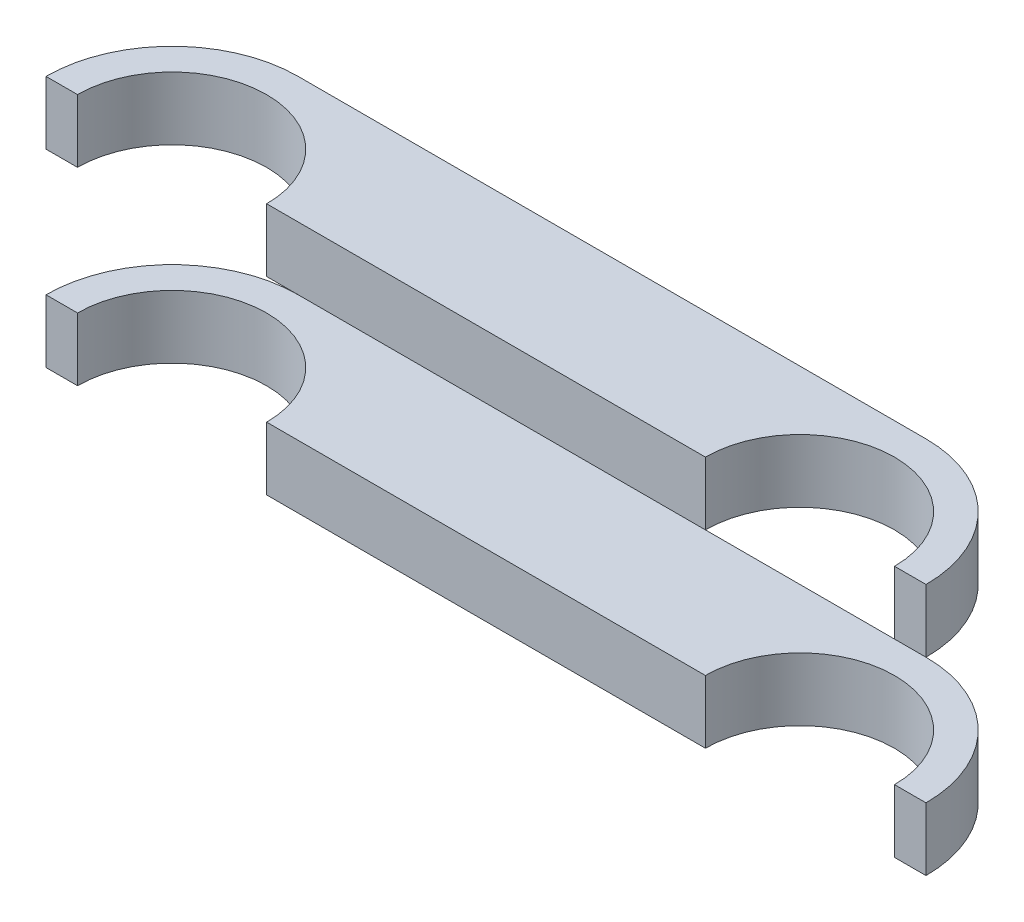
ISO-10303-21;
HEADER;
FILE_DESCRIPTION(('STEP AP214'),'2;1');
FILE_NAME('part.step','',(''),(''),'','','');
FILE_SCHEMA(('AUTOMOTIVE_DESIGN { 1 0 10303 214 1 1 1 1 }'));
ENDSEC;
DATA;
#1=APPLICATION_CONTEXT('core data for automotive mechanical design processes');
#2=APPLICATION_PROTOCOL_DEFINITION('international standard','automotive_design',2000,#1);
#3=PRODUCT_CONTEXT('',#1,'mechanical');
#4=PRODUCT('Part','Part','',(#3));
#5=PRODUCT_RELATED_PRODUCT_CATEGORY('part','',(#4));
#6=PRODUCT_DEFINITION_FORMATION('','',#4);
#7=PRODUCT_DEFINITION_CONTEXT('part definition',#1,'design');
#8=PRODUCT_DEFINITION('design','',#6,#7);
#9=PRODUCT_DEFINITION_SHAPE('','',#8);
#10=(LENGTH_UNIT() NAMED_UNIT(*) SI_UNIT(.MILLI.,.METRE.));
#11=(NAMED_UNIT(*) PLANE_ANGLE_UNIT() SI_UNIT($,.RADIAN.));
#12=(NAMED_UNIT(*) SI_UNIT($,.STERADIAN.) SOLID_ANGLE_UNIT());
#13=UNCERTAINTY_MEASURE_WITH_UNIT(LENGTH_MEASURE(1.E-05),#10,'distance_accuracy_value','');
#14=(GEOMETRIC_REPRESENTATION_CONTEXT(3) GLOBAL_UNCERTAINTY_ASSIGNED_CONTEXT((#13)) GLOBAL_UNIT_ASSIGNED_CONTEXT((#10,
#11,#12)) REPRESENTATION_CONTEXT('',''));
#15=CARTESIAN_POINT('',(0.,0.,0.));
#16=DIRECTION('',(0.,0.,1.));
#17=DIRECTION('',(1.,0.,0.));
#18=AXIS2_PLACEMENT_3D('',#15,#16,#17);
#19=CARTESIAN_POINT('',(0.,-3.175,0.));
#20=DIRECTION('',(0.,1.,0.));
#21=DIRECTION('',(0.,0.,1.));
#22=AXIS2_PLACEMENT_3D('',#19,#20,#21);
#23=PLANE('',#22);
#24=DIRECTION('',(1.,0.,0.));
#25=VECTOR('',#24,1.);
#26=CARTESIAN_POINT('',(0.,-3.175,-10.3187500000315));
#27=LINE('',#26,#25);
#28=CARTESIAN_POINT('',(-11.08075,-3.175,-10.3187500000315));
#29=VERTEX_POINT('',#28);
#30=CARTESIAN_POINT('',(-10.2870000000001,-3.175,-10.3187500000296));
#31=VERTEX_POINT('',#30);
#32=EDGE_CURVE('E54',#29,#31,#27,.T.);
#33=ORIENTED_EDGE('',*,*,#32,.F.);
#34=CARTESIAN_POINT('',(-7.90575,-3.175,-10.31875));
#35=DIRECTION('',(0.,1.,0.));
#36=DIRECTION('',(0.,0.,1.));
#37=AXIS2_PLACEMENT_3D('',#34,#35,#36);
#38=CIRCLE('',#37,3.175);
#39=CARTESIAN_POINT('',(-7.90575,-3.175,-13.49375));
#40=VERTEX_POINT('',#39);
#41=EDGE_CURVE('E122',#40,#29,#38,.T.);
#42=ORIENTED_EDGE('',*,*,#41,.F.);
#43=DIRECTION('',(1.,0.,0.));
#44=VECTOR('',#43,1.);
#45=CARTESIAN_POINT('',(0.,-3.175,-13.49375));
#46=LINE('',#45,#44);
#47=CARTESIAN_POINT('',(7.90575,-3.175,-13.49375));
#48=VERTEX_POINT('',#47);
#49=EDGE_CURVE('E120',#40,#48,#46,.T.);
#50=ORIENTED_EDGE('',*,*,#49,.T.);
#51=CARTESIAN_POINT('',(7.90575,-3.175,-10.31875));
#52=DIRECTION('',(0.,1.,0.));
#53=DIRECTION('',(0.,0.,1.));
#54=AXIS2_PLACEMENT_3D('',#51,#52,#53);
#55=CIRCLE('',#54,3.175);
#56=CARTESIAN_POINT('',(11.08075,-3.175,-10.3187500000315));
#57=VERTEX_POINT('',#56);
#58=EDGE_CURVE('E110',#57,#48,#55,.T.);
#59=ORIENTED_EDGE('',*,*,#58,.F.);
#60=CARTESIAN_POINT('',(10.2869999999999,-3.175,-10.3187500000295));
#61=VERTEX_POINT('',#60);
#62=EDGE_CURVE('E162',#61,#57,#27,.T.);
#63=ORIENTED_EDGE('',*,*,#62,.F.);
#64=CARTESIAN_POINT('',(7.90574999999992,-3.175,-10.3187500000304));
#65=DIRECTION('',(0.,1.,0.));
#66=DIRECTION('',(0.,0.,1.));
#67=AXIS2_PLACEMENT_3D('',#64,#65,#66);
#68=CIRCLE('',#67,2.38125);
#69=CARTESIAN_POINT('',(5.52449999999991,-3.175,-10.3187500000296));
#70=VERTEX_POINT('',#69);
#71=EDGE_CURVE('E150',#70,#61,#68,.F.);
#72=ORIENTED_EDGE('',*,*,#71,.F.);
#73=CARTESIAN_POINT('',(-5.52450000000013,-3.175,-10.3187500000315));
#74=VERTEX_POINT('',#73);
#75=EDGE_CURVE('E144',#74,#70,#27,.T.);
#76=ORIENTED_EDGE('',*,*,#75,.F.);
#77=CARTESIAN_POINT('',(-7.90575000000013,-3.175,-10.3187500000269));
#78=DIRECTION('',(0.,1.,0.));
#79=DIRECTION('',(0.,0.,1.));
#80=AXIS2_PLACEMENT_3D('',#77,#78,#79);
#81=CIRCLE('',#80,2.38125);
#82=EDGE_CURVE('E145',#31,#74,#81,.F.);
#83=ORIENTED_EDGE('',*,*,#82,.F.);
#84=EDGE_LOOP('',(#33,#42,#50,#59,#63,#72,#76,#83));
#85=FACE_BOUND('',#84,.T.);
#86=ADVANCED_FACE('F44',(#85),#23,.F.);
#87=CARTESIAN_POINT('',(7.90575,-3.175,-10.31875));
#88=DIRECTION('',(0.,1.,0.));
#89=DIRECTION('',(0.,0.,1.));
#90=AXIS2_PLACEMENT_3D('',#87,#88,#89);
#91=CYLINDRICAL_SURFACE('',#90,3.175);
#92=CARTESIAN_POINT('',(7.90575,-1.5875,-10.31875));
#93=DIRECTION('',(0.,-1.,0.));
#94=DIRECTION('',(0.,0.,-1.));
#95=AXIS2_PLACEMENT_3D('',#92,#93,#94);
#96=CIRCLE('',#95,3.175);
#97=CARTESIAN_POINT('',(11.08075,-1.5875,-10.3187500000315));
#98=VERTEX_POINT('',#97);
#99=CARTESIAN_POINT('',(7.90575,-1.5875,-13.49375));
#100=VERTEX_POINT('',#99);
#101=EDGE_CURVE('E132',#98,#100,#96,.F.);
#102=ORIENTED_EDGE('',*,*,#101,.F.);
#103=DIRECTION('',(0.,1.,0.));
#104=VECTOR('',#103,1.);
#105=CARTESIAN_POINT('',(11.08075,-3.175,-10.3187500000315));
#106=LINE('',#105,#104);
#107=EDGE_CURVE('E92',#98,#57,#106,.F.);
#108=ORIENTED_EDGE('',*,*,#107,.T.);
#109=ORIENTED_EDGE('',*,*,#58,.T.);
#110=DIRECTION('',(0.,1.,0.));
#111=VECTOR('',#110,1.);
#112=CARTESIAN_POINT('',(7.90575,-3.175,-13.49375));
#113=LINE('',#112,#111);
#114=EDGE_CURVE('E48',#48,#100,#113,.T.);
#115=ORIENTED_EDGE('',*,*,#114,.T.);
#116=EDGE_LOOP('',(#102,#108,#109,#115));
#117=FACE_BOUND('',#116,.T.);
#118=ADVANCED_FACE('F113',(#117),#91,.T.);
#119=CARTESIAN_POINT('',(-7.90575,-3.175,-10.31875));
#120=DIRECTION('',(0.,1.,0.));
#121=DIRECTION('',(0.,0.,1.));
#122=AXIS2_PLACEMENT_3D('',#119,#120,#121);
#123=CYLINDRICAL_SURFACE('',#122,3.175);
#124=ORIENTED_EDGE('',*,*,#41,.T.);
#125=DIRECTION('',(0.,1.,0.));
#126=VECTOR('',#125,1.);
#127=CARTESIAN_POINT('',(-11.08075,-3.175,-10.3187500000315));
#128=LINE('',#127,#126);
#129=CARTESIAN_POINT('',(-11.08075,-1.5875,-10.3187500000315));
#130=VERTEX_POINT('',#129);
#131=EDGE_CURVE('E63',#29,#130,#128,.T.);
#132=ORIENTED_EDGE('',*,*,#131,.T.);
#133=CARTESIAN_POINT('',(-7.90575,-1.5875,-10.31875));
#134=DIRECTION('',(0.,-1.,0.));
#135=DIRECTION('',(0.,0.,-1.));
#136=AXIS2_PLACEMENT_3D('',#133,#134,#135);
#137=CIRCLE('',#136,3.175);
#138=CARTESIAN_POINT('',(-7.90575,-1.5875,-13.49375));
#139=VERTEX_POINT('',#138);
#140=EDGE_CURVE('E138',#139,#130,#137,.F.);
#141=ORIENTED_EDGE('',*,*,#140,.F.);
#142=DIRECTION('',(0.,1.,0.));
#143=VECTOR('',#142,1.);
#144=CARTESIAN_POINT('',(-7.90575,-3.175,-13.49375));
#145=LINE('',#144,#143);
#146=EDGE_CURVE('E165',#40,#139,#145,.T.);
#147=ORIENTED_EDGE('',*,*,#146,.F.);
#148=EDGE_LOOP('',(#124,#132,#141,#147));
#149=FACE_BOUND('',#148,.T.);
#150=ADVANCED_FACE('F167',(#149),#123,.T.);
#151=CARTESIAN_POINT('',(11.6864410687769,-1.5875,4.42758784533106));
#152=DIRECTION('',(0.,-1.,0.));
#153=DIRECTION('',(0.,0.,-1.));
#154=AXIS2_PLACEMENT_3D('',#151,#152,#153);
#155=PLANE('',#154);
#156=DIRECTION('',(-1.,0.,0.));
#157=VECTOR('',#156,1.);
#158=CARTESIAN_POINT('',(11.6864410687769,-1.5875,-10.3187500000315));
#159=LINE('',#158,#157);
#160=CARTESIAN_POINT('',(10.2869999999999,-1.5875,-10.3187500000296));
#161=VERTEX_POINT('',#160);
#162=EDGE_CURVE('E56',#98,#161,#159,.T.);
#163=ORIENTED_EDGE('',*,*,#162,.F.);
#164=ORIENTED_EDGE('',*,*,#101,.T.);
#165=DIRECTION('',(1.,0.,0.));
#166=VECTOR('',#165,1.);
#167=CARTESIAN_POINT('',(0.,-1.5875,-13.49375));
#168=LINE('',#167,#166);
#169=EDGE_CURVE('E129',#139,#100,#168,.T.);
#170=ORIENTED_EDGE('',*,*,#169,.F.);
#171=ORIENTED_EDGE('',*,*,#140,.T.);
#172=CARTESIAN_POINT('',(-10.2870000000001,-1.5875,-10.3187500000298));
#173=VERTEX_POINT('',#172);
#174=EDGE_CURVE('E12',#173,#130,#159,.T.);
#175=ORIENTED_EDGE('',*,*,#174,.F.);
#176=CARTESIAN_POINT('',(-7.90575000000013,-1.5875,-10.3187500000271));
#177=DIRECTION('',(0.,-1.,0.));
#178=DIRECTION('',(0.,0.,-1.));
#179=AXIS2_PLACEMENT_3D('',#176,#177,#178);
#180=CIRCLE('',#179,2.38125);
#181=CARTESIAN_POINT('',(-5.52450000000013,-1.5875,-10.3187500000298));
#182=VERTEX_POINT('',#181);
#183=EDGE_CURVE('E141',#182,#173,#180,.F.);
#184=ORIENTED_EDGE('',*,*,#183,.F.);
#185=DIRECTION('',(-1.,0.,0.));
#186=VECTOR('',#185,1.);
#187=CARTESIAN_POINT('',(2.74963065701559,-1.5875,-10.31875));
#188=LINE('',#187,#186);
#189=CARTESIAN_POINT('',(5.52449999999991,-1.5875,-10.3187500000298));
#190=VERTEX_POINT('',#189);
#191=EDGE_CURVE('E142',#190,#182,#188,.T.);
#192=ORIENTED_EDGE('',*,*,#191,.F.);
#193=CARTESIAN_POINT('',(7.90574999999992,-1.5875,-10.3187500000307));
#194=DIRECTION('',(0.,-1.,0.));
#195=DIRECTION('',(0.,0.,-1.));
#196=AXIS2_PLACEMENT_3D('',#193,#194,#195);
#197=CIRCLE('',#196,2.38125);
#198=EDGE_CURVE('E159',#161,#190,#197,.F.);
#199=ORIENTED_EDGE('',*,*,#198,.F.);
#200=EDGE_LOOP('',(#163,#164,#170,#171,#175,#184,#192,#199));
#201=FACE_BOUND('',#200,.T.);
#202=ADVANCED_FACE('F170',(#201),#155,.F.);
#203=CARTESIAN_POINT('',(-7.90575000000012,8.69949999999987,-10.3187500000289));
#204=DIRECTION('',(0.,-1.,1.6769918786963E-13));
#205=DIRECTION('',(-1.,0.,2.21020759978035E-13));
#206=AXIS2_PLACEMENT_3D('',#203,#204,#205);
#207=CYLINDRICAL_SURFACE('',#206,2.38125);
#208=ORIENTED_EDGE('',*,*,#183,.T.);
#209=DIRECTION('',(0.,-1.,1.6769918786963E-13));
#210=VECTOR('',#209,1.);
#211=CARTESIAN_POINT('',(-10.2870000000001,8.69949999999987,-10.3187500000315));
#212=LINE('',#211,#210);
#213=EDGE_CURVE('E149',#173,#31,#212,.T.);
#214=ORIENTED_EDGE('',*,*,#213,.T.);
#215=ORIENTED_EDGE('',*,*,#82,.T.);
#216=DIRECTION('',(0.,-1.,1.6769918786963E-13));
#217=VECTOR('',#216,1.);
#218=CARTESIAN_POINT('',(-5.52450000000012,8.69949999999987,-10.3187500000315));
#219=LINE('',#218,#217);
#220=EDGE_CURVE('E148',#74,#182,#219,.F.);
#221=ORIENTED_EDGE('',*,*,#220,.T.);
#222=EDGE_LOOP('',(#208,#214,#215,#221));
#223=FACE_BOUND('',#222,.T.);
#224=ADVANCED_FACE('F179',(#223),#207,.F.);
#225=CARTESIAN_POINT('',(7.90574999999992,8.69949999999989,-10.3187500000324));
#226=DIRECTION('',(0.,-1.,1.67588165567167E-13));
#227=DIRECTION('',(1.,0.,-2.20911952267685E-13));
#228=AXIS2_PLACEMENT_3D('',#225,#226,#227);
#229=CYLINDRICAL_SURFACE('',#228,2.38125);
#230=ORIENTED_EDGE('',*,*,#198,.T.);
#231=DIRECTION('',(0.,-1.,1.67588165567167E-13));
#232=VECTOR('',#231,1.);
#233=CARTESIAN_POINT('',(5.52449999999992,8.69949999999989,-10.3187500000315));
#234=LINE('',#233,#232);
#235=EDGE_CURVE('E153',#190,#70,#234,.T.);
#236=ORIENTED_EDGE('',*,*,#235,.T.);
#237=ORIENTED_EDGE('',*,*,#71,.T.);
#238=DIRECTION('',(0.,-1.,1.67588165567167E-13));
#239=VECTOR('',#238,1.);
#240=CARTESIAN_POINT('',(10.2869999999999,8.69949999999989,-10.3187500000315));
#241=LINE('',#240,#239);
#242=EDGE_CURVE('E152',#61,#161,#241,.F.);
#243=ORIENTED_EDGE('',*,*,#242,.T.);
#244=EDGE_LOOP('',(#230,#236,#237,#243));
#245=FACE_BOUND('',#244,.T.);
#246=ADVANCED_FACE('F202',(#245),#229,.F.);
#247=CARTESIAN_POINT('',(0.,-3.175,-13.49375));
#248=DIRECTION('',(0.,0.,1.));
#249=DIRECTION('',(1.,0.,0.));
#250=AXIS2_PLACEMENT_3D('',#247,#248,#249);
#251=PLANE('',#250);
#252=ORIENTED_EDGE('',*,*,#146,.T.);
#253=ORIENTED_EDGE('',*,*,#169,.T.);
#254=ORIENTED_EDGE('',*,*,#114,.F.);
#255=ORIENTED_EDGE('',*,*,#49,.F.);
#256=EDGE_LOOP('',(#252,#253,#254,#255));
#257=FACE_BOUND('',#256,.T.);
#258=ADVANCED_FACE('F127',(#257),#251,.F.);
#259=CARTESIAN_POINT('',(0.,0.,-10.3187500000315));
#260=DIRECTION('',(0.,0.,1.));
#261=DIRECTION('',(1.,0.,0.));
#262=AXIS2_PLACEMENT_3D('',#259,#260,#261);
#263=PLANE('',#262);
#264=ORIENTED_EDGE('',*,*,#62,.T.);
#265=ORIENTED_EDGE('',*,*,#107,.F.);
#266=ORIENTED_EDGE('',*,*,#162,.T.);
#267=ORIENTED_EDGE('',*,*,#242,.F.);
#268=EDGE_LOOP('',(#264,#265,#266,#267));
#269=FACE_BOUND('',#268,.T.);
#270=ADVANCED_FACE('F187',(#269),#263,.T.);
#271=ORIENTED_EDGE('',*,*,#191,.T.);
#272=ORIENTED_EDGE('',*,*,#220,.F.);
#273=ORIENTED_EDGE('',*,*,#75,.T.);
#274=ORIENTED_EDGE('',*,*,#235,.F.);
#275=EDGE_LOOP('',(#271,#272,#273,#274));
#276=FACE_BOUND('',#275,.T.);
#277=ADVANCED_FACE('F184',(#276),#263,.T.);
#278=ORIENTED_EDGE('',*,*,#32,.T.);
#279=ORIENTED_EDGE('',*,*,#213,.F.);
#280=ORIENTED_EDGE('',*,*,#174,.T.);
#281=ORIENTED_EDGE('',*,*,#131,.F.);
#282=EDGE_LOOP('',(#278,#279,#280,#281));
#283=FACE_BOUND('',#282,.T.);
#284=ADVANCED_FACE('F46',(#283),#263,.T.);
#285=CLOSED_SHELL('',(#86,#118,#150,#202,#224,#246,#258,#270,#277,#284));
#286=MANIFOLD_SOLID_BREP('B2',#285);
#287=CARTESIAN_POINT('',(0.,-3.175,-13.49375));
#288=DIRECTION('',(0.,0.,1.));
#289=DIRECTION('',(1.,0.,0.));
#290=AXIS2_PLACEMENT_3D('',#287,#288,#289);
#291=PLANE('',#290);
#292=DIRECTION('',(0.,1.,0.));
#293=VECTOR('',#292,1.);
#294=CARTESIAN_POINT('',(7.90575,-3.175,-13.49375));
#295=LINE('',#294,#293);
#296=CARTESIAN_POINT('',(7.90575,1.5875,-13.49375));
#297=VERTEX_POINT('',#296);
#298=CARTESIAN_POINT('',(7.90575,3.175,-13.49375));
#299=VERTEX_POINT('',#298);
#300=EDGE_CURVE('E385',#297,#299,#295,.T.);
#301=ORIENTED_EDGE('',*,*,#300,.F.);
#302=DIRECTION('',(-1.,0.,0.));
#303=VECTOR('',#302,1.);
#304=CARTESIAN_POINT('',(0.,1.5875,-13.49375));
#305=LINE('',#304,#303);
#306=CARTESIAN_POINT('',(-7.90575,1.5875,-13.49375));
#307=VERTEX_POINT('',#306);
#308=EDGE_CURVE('E348',#297,#307,#305,.T.);
#309=ORIENTED_EDGE('',*,*,#308,.T.);
#310=DIRECTION('',(0.,1.,0.));
#311=VECTOR('',#310,1.);
#312=CARTESIAN_POINT('',(-7.90575,-3.175,-13.49375));
#313=LINE('',#312,#311);
#314=CARTESIAN_POINT('',(-7.90575,3.175,-13.49375));
#315=VERTEX_POINT('',#314);
#316=EDGE_CURVE('E386',#307,#315,#313,.T.);
#317=ORIENTED_EDGE('',*,*,#316,.T.);
#318=DIRECTION('',(1.,0.,0.));
#319=VECTOR('',#318,1.);
#320=CARTESIAN_POINT('',(0.,3.175,-13.49375));
#321=LINE('',#320,#319);
#322=EDGE_CURVE('E379',#315,#299,#321,.T.);
#323=ORIENTED_EDGE('',*,*,#322,.T.);
#324=EDGE_LOOP('',(#301,#309,#317,#323));
#325=FACE_BOUND('',#324,.T.);
#326=ADVANCED_FACE('F275',(#325),#291,.F.);
#327=CARTESIAN_POINT('',(-7.90575000000012,8.69949999999987,-10.3187500000289));
#328=DIRECTION('',(0.,-1.,1.6769918786963E-13));
#329=DIRECTION('',(-1.,0.,2.21020759978035E-13));
#330=AXIS2_PLACEMENT_3D('',#327,#328,#329);
#331=CYLINDRICAL_SURFACE('',#330,2.38125);
#332=CARTESIAN_POINT('',(-7.90575000000012,3.175,-10.3187500000279));
#333=DIRECTION('',(0.,1.,0.));
#334=DIRECTION('',(0.,0.,1.));
#335=AXIS2_PLACEMENT_3D('',#332,#333,#334);
#336=CIRCLE('',#335,2.38125);
#337=CARTESIAN_POINT('',(-10.2870000000001,3.175,-10.3187500000306));
#338=VERTEX_POINT('',#337);
#339=CARTESIAN_POINT('',(-5.52450000000012,3.175,-10.3187500000315));
#340=VERTEX_POINT('',#339);
#341=EDGE_CURVE('E370',#338,#340,#336,.F.);
#342=ORIENTED_EDGE('',*,*,#341,.F.);
#343=DIRECTION('',(0.,-1.,1.6769918786963E-13));
#344=VECTOR('',#343,1.);
#345=CARTESIAN_POINT('',(-10.2870000000001,8.69949999999987,-10.3187500000315));
#346=LINE('',#345,#344);
#347=CARTESIAN_POINT('',(-10.2870000000001,1.5875,-10.3187500000304));
#348=VERTEX_POINT('',#347);
#349=EDGE_CURVE('E412',#338,#348,#346,.T.);
#350=ORIENTED_EDGE('',*,*,#349,.T.);
#351=CARTESIAN_POINT('',(-7.90575000000012,1.5875,-10.3187500000277));
#352=DIRECTION('',(0.,1.,0.));
#353=DIRECTION('',(0.,0.,1.));
#354=AXIS2_PLACEMENT_3D('',#351,#352,#353);
#355=CIRCLE('',#354,2.38125);
#356=CARTESIAN_POINT('',(-5.52450000000012,1.5875,-10.3187500000315));
#357=VERTEX_POINT('',#356);
#358=EDGE_CURVE('E361',#348,#357,#355,.F.);
#359=ORIENTED_EDGE('',*,*,#358,.T.);
#360=DIRECTION('',(0.,-1.,1.6769918786963E-13));
#361=VECTOR('',#360,1.);
#362=CARTESIAN_POINT('',(-5.52450000000012,8.69949999999987,-10.3187500000315));
#363=LINE('',#362,#361);
#364=EDGE_CURVE('E408',#357,#340,#363,.F.);
#365=ORIENTED_EDGE('',*,*,#364,.T.);
#366=EDGE_LOOP('',(#342,#350,#359,#365));
#367=FACE_BOUND('',#366,.T.);
#368=ADVANCED_FACE('F416',(#367),#331,.F.);
#369=CARTESIAN_POINT('',(7.90574999999992,8.69949999999989,-10.3187500000324));
#370=DIRECTION('',(0.,-1.,1.67588165567167E-13));
#371=DIRECTION('',(1.,0.,-2.20911952267685E-13));
#372=AXIS2_PLACEMENT_3D('',#369,#370,#371);
#373=CYLINDRICAL_SURFACE('',#372,2.38125);
#374=CARTESIAN_POINT('',(7.90574999999992,3.175,-10.3187500000315));
#375=DIRECTION('',(0.,1.,0.));
#376=DIRECTION('',(0.,0.,1.));
#377=AXIS2_PLACEMENT_3D('',#374,#375,#376);
#378=CIRCLE('',#377,2.38125);
#379=CARTESIAN_POINT('',(5.52449999999992,3.175,-10.3187500000306));
#380=VERTEX_POINT('',#379);
#381=CARTESIAN_POINT('',(10.2869999999999,3.175,-10.3187500000304));
#382=VERTEX_POINT('',#381);
#383=EDGE_CURVE('E358',#380,#382,#378,.F.);
#384=ORIENTED_EDGE('',*,*,#383,.F.);
#385=DIRECTION('',(0.,-1.,1.67588165567167E-13));
#386=VECTOR('',#385,1.);
#387=CARTESIAN_POINT('',(5.52449999999992,8.69949999999989,-10.3187500000315));
#388=LINE('',#387,#386);
#389=CARTESIAN_POINT('',(5.52449999999991,1.5875,-10.3187500000304));
#390=VERTEX_POINT('',#389);
#391=EDGE_CURVE('E42',#380,#390,#388,.T.);
#392=ORIENTED_EDGE('',*,*,#391,.T.);
#393=CARTESIAN_POINT('',(7.90574999999992,1.5875,-10.3187500000312));
#394=DIRECTION('',(0.,1.,0.));
#395=DIRECTION('',(0.,0.,1.));
#396=AXIS2_PLACEMENT_3D('',#393,#394,#395);
#397=CIRCLE('',#396,2.38125);
#398=CARTESIAN_POINT('',(10.2869999999999,1.5875,-10.3187500000303));
#399=VERTEX_POINT('',#398);
#400=EDGE_CURVE('E353',#390,#399,#397,.F.);
#401=ORIENTED_EDGE('',*,*,#400,.T.);
#402=DIRECTION('',(0.,-1.,1.67588165567167E-13));
#403=VECTOR('',#402,1.);
#404=CARTESIAN_POINT('',(10.2869999999999,8.69949999999989,-10.3187500000315));
#405=LINE('',#404,#403);
#406=EDGE_CURVE('E283',#399,#382,#405,.F.);
#407=ORIENTED_EDGE('',*,*,#406,.T.);
#408=EDGE_LOOP('',(#384,#392,#401,#407));
#409=FACE_BOUND('',#408,.T.);
#410=ADVANCED_FACE('F357',(#409),#373,.F.);
#411=CARTESIAN_POINT('',(11.6864410687769,1.5875,4.42758784533106));
#412=DIRECTION('',(0.,1.,0.));
#413=DIRECTION('',(0.,0.,1.));
#414=AXIS2_PLACEMENT_3D('',#411,#412,#413);
#415=PLANE('',#414);
#416=DIRECTION('',(1.,0.,0.));
#417=VECTOR('',#416,1.);
#418=CARTESIAN_POINT('',(11.6864410687769,1.5875,-10.3187500000315));
#419=LINE('',#418,#417);
#420=CARTESIAN_POINT('',(-11.08075,1.5875,-10.3187500000315));
#421=VERTEX_POINT('',#420);
#422=EDGE_CURVE('E290',#421,#348,#419,.T.);
#423=ORIENTED_EDGE('',*,*,#422,.F.);
#424=CARTESIAN_POINT('',(-7.90575,1.5875,-10.31875));
#425=DIRECTION('',(0.,1.,0.));
#426=DIRECTION('',(0.,0.,1.));
#427=AXIS2_PLACEMENT_3D('',#424,#425,#426);
#428=CIRCLE('',#427,3.175);
#429=EDGE_CURVE('E374',#421,#307,#428,.F.);
#430=ORIENTED_EDGE('',*,*,#429,.T.);
#431=ORIENTED_EDGE('',*,*,#308,.F.);
#432=CARTESIAN_POINT('',(7.90575,1.5875,-10.31875));
#433=DIRECTION('',(0.,1.,0.));
#434=DIRECTION('',(0.,0.,1.));
#435=AXIS2_PLACEMENT_3D('',#432,#433,#434);
#436=CIRCLE('',#435,3.175);
#437=CARTESIAN_POINT('',(11.08075,1.5875,-10.3187500000315));
#438=VERTEX_POINT('',#437);
#439=EDGE_CURVE('E355',#297,#438,#436,.F.);
#440=ORIENTED_EDGE('',*,*,#439,.T.);
#441=EDGE_CURVE('E340',#399,#438,#419,.T.);
#442=ORIENTED_EDGE('',*,*,#441,.F.);
#443=ORIENTED_EDGE('',*,*,#400,.F.);
#444=DIRECTION('',(1.,0.,0.));
#445=VECTOR('',#444,1.);
#446=CARTESIAN_POINT('',(2.74963065701559,1.5875,-10.31875));
#447=LINE('',#446,#445);
#448=EDGE_CURVE('E298',#357,#390,#447,.T.);
#449=ORIENTED_EDGE('',*,*,#448,.F.);
#450=ORIENTED_EDGE('',*,*,#358,.F.);
#451=EDGE_LOOP('',(#423,#430,#431,#440,#442,#443,#449,#450));
#452=FACE_BOUND('',#451,.T.);
#453=ADVANCED_FACE('F352',(#452),#415,.F.);
#454=CARTESIAN_POINT('',(0.,3.175,0.));
#455=DIRECTION('',(0.,1.,0.));
#456=DIRECTION('',(0.,0.,1.));
#457=AXIS2_PLACEMENT_3D('',#454,#455,#456);
#458=PLANE('',#457);
#459=CARTESIAN_POINT('',(-7.90575,3.175,-10.31875));
#460=DIRECTION('',(0.,1.,0.));
#461=DIRECTION('',(0.,0.,1.));
#462=AXIS2_PLACEMENT_3D('',#459,#460,#461);
#463=CIRCLE('',#462,3.175);
#464=CARTESIAN_POINT('',(-11.08075,3.175,-10.3187500000315));
#465=VERTEX_POINT('',#464);
#466=EDGE_CURVE('E382',#315,#465,#463,.T.);
#467=ORIENTED_EDGE('',*,*,#466,.T.);
#468=DIRECTION('',(1.,0.,0.));
#469=VECTOR('',#468,1.);
#470=CARTESIAN_POINT('',(0.,3.175,-10.3187500000315));
#471=LINE('',#470,#469);
#472=EDGE_CURVE('E364',#465,#338,#471,.T.);
#473=ORIENTED_EDGE('',*,*,#472,.T.);
#474=ORIENTED_EDGE('',*,*,#341,.T.);
#475=EDGE_CURVE('E405',#340,#380,#471,.T.);
#476=ORIENTED_EDGE('',*,*,#475,.T.);
#477=ORIENTED_EDGE('',*,*,#383,.T.);
#478=CARTESIAN_POINT('',(11.08075,3.175,-10.3187500000315));
#479=VERTEX_POINT('',#478);
#480=EDGE_CURVE('E343',#382,#479,#471,.T.);
#481=ORIENTED_EDGE('',*,*,#480,.T.);
#482=CARTESIAN_POINT('',(7.90575,3.175,-10.31875));
#483=DIRECTION('',(0.,1.,0.));
#484=DIRECTION('',(0.,0.,1.));
#485=AXIS2_PLACEMENT_3D('',#482,#483,#484);
#486=CIRCLE('',#485,3.175);
#487=EDGE_CURVE('E377',#479,#299,#486,.T.);
#488=ORIENTED_EDGE('',*,*,#487,.T.);
#489=ORIENTED_EDGE('',*,*,#322,.F.);
#490=EDGE_LOOP('',(#467,#473,#474,#476,#477,#481,#488,#489));
#491=FACE_BOUND('',#490,.T.);
#492=ADVANCED_FACE('F401',(#491),#458,.T.);
#493=CARTESIAN_POINT('',(-7.90575,-3.175,-10.31875));
#494=DIRECTION('',(0.,1.,0.));
#495=DIRECTION('',(0.,0.,1.));
#496=AXIS2_PLACEMENT_3D('',#493,#494,#495);
#497=CYLINDRICAL_SURFACE('',#496,3.175);
#498=ORIENTED_EDGE('',*,*,#429,.F.);
#499=DIRECTION('',(0.,1.,0.));
#500=VECTOR('',#499,1.);
#501=CARTESIAN_POINT('',(-11.08075,-3.175,-10.3187500000315));
#502=LINE('',#501,#500);
#503=EDGE_CURVE('E359',#421,#465,#502,.T.);
#504=ORIENTED_EDGE('',*,*,#503,.T.);
#505=ORIENTED_EDGE('',*,*,#466,.F.);
#506=ORIENTED_EDGE('',*,*,#316,.F.);
#507=EDGE_LOOP('',(#498,#504,#505,#506));
#508=FACE_BOUND('',#507,.T.);
#509=ADVANCED_FACE('F397',(#508),#497,.T.);
#510=CARTESIAN_POINT('',(7.90575,-3.175,-10.31875));
#511=DIRECTION('',(0.,1.,0.));
#512=DIRECTION('',(0.,0.,1.));
#513=AXIS2_PLACEMENT_3D('',#510,#511,#512);
#514=CYLINDRICAL_SURFACE('',#513,3.175);
#515=ORIENTED_EDGE('',*,*,#487,.F.);
#516=DIRECTION('',(0.,1.,0.));
#517=VECTOR('',#516,1.);
#518=CARTESIAN_POINT('',(11.08075,-3.175,-10.3187500000315));
#519=LINE('',#518,#517);
#520=EDGE_CURVE('E404',#479,#438,#519,.F.);
#521=ORIENTED_EDGE('',*,*,#520,.T.);
#522=ORIENTED_EDGE('',*,*,#439,.F.);
#523=ORIENTED_EDGE('',*,*,#300,.T.);
#524=EDGE_LOOP('',(#515,#521,#522,#523));
#525=FACE_BOUND('',#524,.T.);
#526=ADVANCED_FACE('F277',(#525),#514,.T.);
#527=CARTESIAN_POINT('',(0.,0.,-10.3187500000315));
#528=DIRECTION('',(0.,0.,1.));
#529=DIRECTION('',(1.,0.,0.));
#530=AXIS2_PLACEMENT_3D('',#527,#528,#529);
#531=PLANE('',#530);
#532=ORIENTED_EDGE('',*,*,#480,.F.);
#533=ORIENTED_EDGE('',*,*,#406,.F.);
#534=ORIENTED_EDGE('',*,*,#441,.T.);
#535=ORIENTED_EDGE('',*,*,#520,.F.);
#536=EDGE_LOOP('',(#532,#533,#534,#535));
#537=FACE_BOUND('',#536,.T.);
#538=ADVANCED_FACE('F339',(#537),#531,.T.);
#539=ORIENTED_EDGE('',*,*,#364,.F.);
#540=ORIENTED_EDGE('',*,*,#448,.T.);
#541=ORIENTED_EDGE('',*,*,#391,.F.);
#542=ORIENTED_EDGE('',*,*,#475,.F.);
#543=EDGE_LOOP('',(#539,#540,#541,#542));
#544=FACE_BOUND('',#543,.T.);
#545=ADVANCED_FACE('F417',(#544),#531,.T.);
#546=ORIENTED_EDGE('',*,*,#422,.T.);
#547=ORIENTED_EDGE('',*,*,#349,.F.);
#548=ORIENTED_EDGE('',*,*,#472,.F.);
#549=ORIENTED_EDGE('',*,*,#503,.F.);
#550=EDGE_LOOP('',(#546,#547,#548,#549));
#551=FACE_BOUND('',#550,.T.);
#552=ADVANCED_FACE('F419',(#551),#531,.T.);
#553=CLOSED_SHELL('',(#326,#368,#410,#453,#492,#509,#526,#538,#545,#552));
#554=MANIFOLD_SOLID_BREP('B6',#553);
#555=ADVANCED_BREP_SHAPE_REPRESENTATION('',(#18,#286,#554),#14);
#556=SHAPE_DEFINITION_REPRESENTATION(#9,#555);
ENDSEC;
END-ISO-10303-21;
